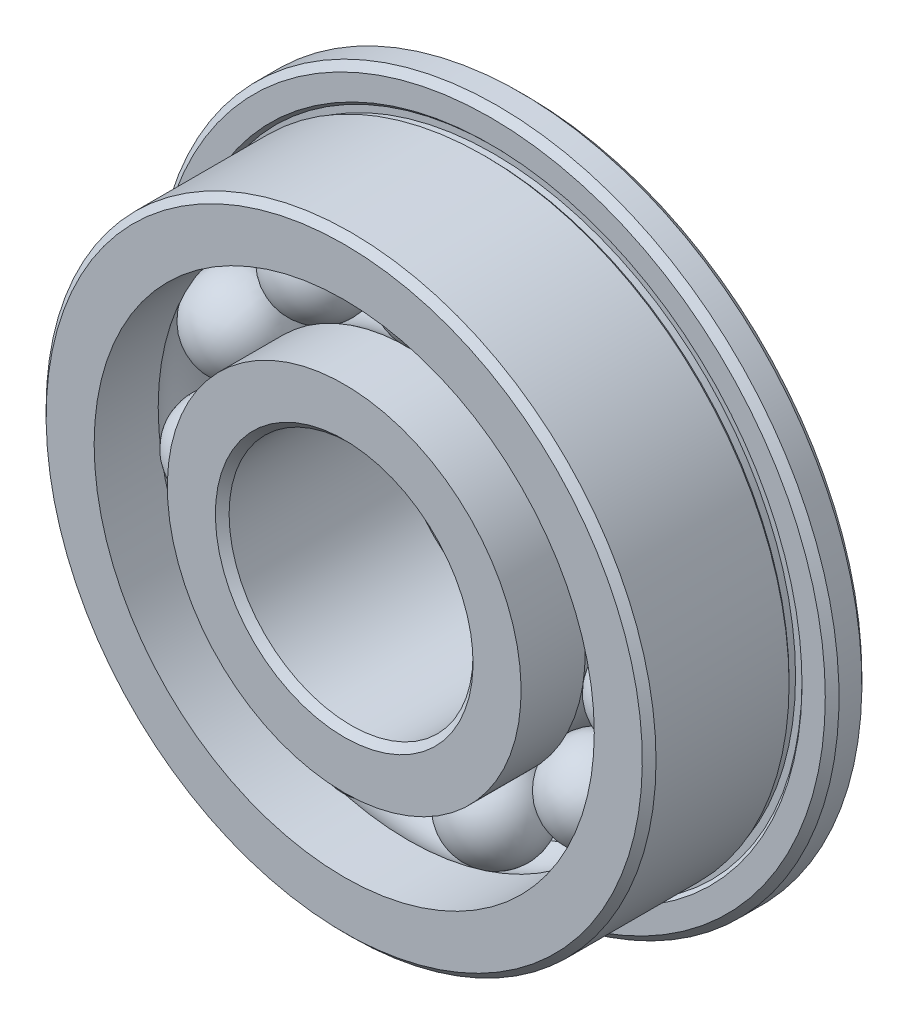
ISO-10303-21;
HEADER;
FILE_DESCRIPTION(('STEP AP214'),'2;1');
FILE_NAME('part.step','',(''),(''),'','','');
FILE_SCHEMA(('AUTOMOTIVE_DESIGN { 1 0 10303 214 1 1 1 1 }'));
ENDSEC;
DATA;
#1=APPLICATION_CONTEXT('core data for automotive mechanical design processes');
#2=APPLICATION_PROTOCOL_DEFINITION('international standard','automotive_design',2000,#1);
#3=PRODUCT_CONTEXT('',#1,'mechanical');
#4=PRODUCT('Part','Part','',(#3));
#5=PRODUCT_RELATED_PRODUCT_CATEGORY('part','',(#4));
#6=PRODUCT_DEFINITION_FORMATION('','',#4);
#7=PRODUCT_DEFINITION_CONTEXT('part definition',#1,'design');
#8=PRODUCT_DEFINITION('design','',#6,#7);
#9=PRODUCT_DEFINITION_SHAPE('','',#8);
#10=(LENGTH_UNIT() NAMED_UNIT(*) SI_UNIT(.MILLI.,.METRE.));
#11=(NAMED_UNIT(*) PLANE_ANGLE_UNIT() SI_UNIT($,.RADIAN.));
#12=(NAMED_UNIT(*) SI_UNIT($,.STERADIAN.) SOLID_ANGLE_UNIT());
#13=UNCERTAINTY_MEASURE_WITH_UNIT(LENGTH_MEASURE(1.E-05),#10,'distance_accuracy_value','');
#14=(GEOMETRIC_REPRESENTATION_CONTEXT(3) GLOBAL_UNCERTAINTY_ASSIGNED_CONTEXT((#13)) GLOBAL_UNIT_ASSIGNED_CONTEXT((#10,
#11,#12)) REPRESENTATION_CONTEXT('',''));
#15=CARTESIAN_POINT('',(0.,0.,0.));
#16=DIRECTION('',(0.,0.,1.));
#17=DIRECTION('',(1.,0.,0.));
#18=AXIS2_PLACEMENT_3D('',#15,#16,#17);
#19=CARTESIAN_POINT('',(-1.89224286109455,2.94438736490916,0.));
#20=DIRECTION('',(-0.540640817455586,0.841253532831188,0.));
#21=DIRECTION('',(0.841253532831188,0.540640817455586,0.));
#22=AXIS2_PLACEMENT_3D('',#19,#20,#21);
#23=SPHERICAL_SURFACE('',#22,0.75);
#24=CARTESIAN_POINT('',(-2.29772347418624,3.57532751453255,0.));
#25=VERTEX_POINT('',#24);
#26=VERTEX_LOOP('',#25);
#27=FACE_BOUND('',#26,.T.);
#28=ADVANCED_FACE('F43',(#27),#23,.T.);
#29=CLOSED_SHELL('',(#28));
#30=MANIFOLD_SOLID_BREP('B2',#29);
#31=CARTESIAN_POINT('',(-3.1837119837408,1.45395254550664,0.));
#32=DIRECTION('',(-0.909631995354514,0.415415013001897,0.));
#33=DIRECTION('',(0.415415013001897,0.909631995354514,0.));
#34=AXIS2_PLACEMENT_3D('',#31,#32,#33);
#35=SPHERICAL_SURFACE('',#34,0.75);
#36=CARTESIAN_POINT('',(-3.86593598025668,1.76551380525806,0.));
#37=VERTEX_POINT('',#36);
#38=VERTEX_LOOP('',#37);
#39=FACE_BOUND('',#38,.T.);
#40=ADVANCED_FACE('F63',(#39),#35,.T.);
#41=CLOSED_SHELL('',(#40));
#42=MANIFOLD_SOLID_BREP('B7',#41);
#43=CARTESIAN_POINT('',(-3.46437504658327,-0.498101933956461,0.));
#44=DIRECTION('',(-0.989821441880934,-0.142314838273275,0.));
#45=DIRECTION('',(-0.142314838273275,0.989821441880934,0.));
#46=AXIS2_PLACEMENT_3D('',#43,#44,#45);
#47=SPHERICAL_SURFACE('',#46,0.75);
#48=CARTESIAN_POINT('',(-4.20674112799397,-0.604838062661418,0.));
#49=VERTEX_POINT('',#48);
#50=VERTEX_LOOP('',#49);
#51=FACE_BOUND('',#50,.T.);
#52=ADVANCED_FACE('F83',(#51),#47,.T.);
#53=CLOSED_SHELL('',(#52));
#54=MANIFOLD_SOLID_BREP('B39',#53);
#55=CARTESIAN_POINT('',(-2.64512351023993,-2.29201256880847,0.));
#56=DIRECTION('',(-0.755749574354264,-0.654860733945278,0.));
#57=DIRECTION('',(-0.654860733945278,0.755749574354264,0.));
#58=AXIS2_PLACEMENT_3D('',#55,#56,#57);
#59=SPHERICAL_SURFACE('',#58,0.75);
#60=CARTESIAN_POINT('',(-3.21193569100562,-2.78315811926743,0.));
#61=VERTEX_POINT('',#60);
#62=VERTEX_LOOP('',#61);
#63=FACE_BOUND('',#62,.T.);
#64=ADVANCED_FACE('F103',(#63),#59,.T.);
#65=CLOSED_SHELL('',(#64));
#66=MANIFOLD_SOLID_BREP('B59',#65);
#67=CARTESIAN_POINT('',(-0.98606394894503,-3.35822540765073,0.));
#68=DIRECTION('',(-0.281732556841437,-0.959492973614495,0.));
#69=DIRECTION('',(-0.959492973614495,0.281732556841437,0.));
#70=AXIS2_PLACEMENT_3D('',#67,#68,#69);
#71=SPHERICAL_SURFACE('',#70,0.75);
#72=CARTESIAN_POINT('',(-1.19736336657611,-4.0778451378616,0.));
#73=VERTEX_POINT('',#72);
#74=VERTEX_LOOP('',#73);
#75=FACE_BOUND('',#74,.T.);
#76=ADVANCED_FACE('F123',(#75),#71,.T.);
#77=CLOSED_SHELL('',(#76));
#78=MANIFOLD_SOLID_BREP('B79',#77);
#79=CARTESIAN_POINT('',(0.986063948944982,-3.35822540765075,0.));
#80=DIRECTION('',(0.281732556841423,-0.959492973614499,0.));
#81=DIRECTION('',(-0.959492973614499,-0.281732556841423,0.));
#82=AXIS2_PLACEMENT_3D('',#79,#80,#81);
#83=SPHERICAL_SURFACE('',#82,0.75);
#84=CARTESIAN_POINT('',(1.19736336657605,-4.07784513786162,0.));
#85=VERTEX_POINT('',#84);
#86=VERTEX_LOOP('',#85);
#87=FACE_BOUND('',#86,.T.);
#88=ADVANCED_FACE('F143',(#87),#83,.T.);
#89=CLOSED_SHELL('',(#88));
#90=MANIFOLD_SOLID_BREP('B99',#89);
#91=CARTESIAN_POINT('',(2.64512351023989,-2.29201256880851,0.));
#92=DIRECTION('',(0.755749574354255,-0.654860733945289,0.));
#93=DIRECTION('',(-0.654860733945289,-0.755749574354255,0.));
#94=AXIS2_PLACEMENT_3D('',#91,#92,#93);
#95=SPHERICAL_SURFACE('',#94,0.75);
#96=CARTESIAN_POINT('',(3.21193569100558,-2.78315811926748,0.));
#97=VERTEX_POINT('',#96);
#98=VERTEX_LOOP('',#97);
#99=FACE_BOUND('',#98,.T.);
#100=ADVANCED_FACE('F163',(#99),#95,.T.);
#101=CLOSED_SHELL('',(#100));
#102=MANIFOLD_SOLID_BREP('B119',#101);
#103=CARTESIAN_POINT('',(3.46437504658326,-0.498101933956511,0.));
#104=DIRECTION('',(0.989821441880932,-0.142314838273289,0.));
#105=DIRECTION('',(-0.142314838273289,-0.989821441880932,0.));
#106=AXIS2_PLACEMENT_3D('',#103,#104,#105);
#107=SPHERICAL_SURFACE('',#106,0.75);
#108=CARTESIAN_POINT('',(4.20674112799396,-0.604838062661478,0.));
#109=VERTEX_POINT('',#108);
#110=VERTEX_LOOP('',#109);
#111=FACE_BOUND('',#110,.T.);
#112=ADVANCED_FACE('F183',(#111),#107,.T.);
#113=CLOSED_SHELL('',(#112));
#114=MANIFOLD_SOLID_BREP('B139',#113);
#115=CARTESIAN_POINT('',(3.18371198374082,1.45395254550659,0.));
#116=DIRECTION('',(0.909631995354519,0.415415013001884,0.));
#117=DIRECTION('',(0.415415013001884,-0.909631995354519,0.));
#118=AXIS2_PLACEMENT_3D('',#115,#116,#117);
#119=SPHERICAL_SURFACE('',#118,0.75);
#120=CARTESIAN_POINT('',(3.86593598025671,1.76551380525801,0.));
#121=VERTEX_POINT('',#120);
#122=VERTEX_LOOP('',#121);
#123=FACE_BOUND('',#122,.T.);
#124=ADVANCED_FACE('F203',(#123),#119,.T.);
#125=CLOSED_SHELL('',(#124));
#126=MANIFOLD_SOLID_BREP('B159',#125);
#127=CARTESIAN_POINT('',(1.8922428610946,2.94438736490913,0.));
#128=DIRECTION('',(0.540640817455599,0.841253532831181,0.));
#129=DIRECTION('',(0.841253532831181,-0.540640817455599,0.));
#130=AXIS2_PLACEMENT_3D('',#127,#128,#129);
#131=SPHERICAL_SURFACE('',#130,0.75);
#132=CARTESIAN_POINT('',(2.2977234741863,3.57532751453252,0.));
#133=VERTEX_POINT('',#132);
#134=VERTEX_LOOP('',#133);
#135=FACE_BOUND('',#134,.T.);
#136=ADVANCED_FACE('F223',(#135),#131,.T.);
#137=CLOSED_SHELL('',(#136));
#138=MANIFOLD_SOLID_BREP('B179',#137);
#139=CARTESIAN_POINT('',(0.,3.5,0.));
#140=DIRECTION('',(0.,1.,0.));
#141=DIRECTION('',(1.,0.,0.));
#142=AXIS2_PLACEMENT_3D('',#139,#140,#141);
#143=SPHERICAL_SURFACE('',#142,0.75);
#144=CARTESIAN_POINT('',(0.,4.25,0.));
#145=VERTEX_POINT('',#144);
#146=VERTEX_LOOP('',#145);
#147=FACE_BOUND('',#146,.T.);
#148=ADVANCED_FACE('F246',(#147),#143,.T.);
#149=CLOSED_SHELL('',(#148));
#150=MANIFOLD_SOLID_BREP('B199',#149);
#151=CARTESIAN_POINT('',(0.,0.,0.));
#152=DIRECTION('',(0.,0.,1.));
#153=DIRECTION('',(0.,-1.,0.));
#154=AXIS2_PLACEMENT_3D('',#151,#152,#153);
#155=CYLINDRICAL_SURFACE('',#154,2.9);
#156=CARTESIAN_POINT('',(0.,0.,-0.449999999999999));
#157=DIRECTION('',(0.,0.,1.));
#158=DIRECTION('',(0.,-1.,0.));
#159=AXIS2_PLACEMENT_3D('',#156,#157,#158);
#160=CIRCLE('',#159,2.9);
#161=CARTESIAN_POINT('',(0.,-2.9,-0.449999999999999));
#162=VERTEX_POINT('',#161);
#163=EDGE_CURVE('E287',#162,#162,#160,.T.);
#164=ORIENTED_EDGE('',*,*,#163,.F.);
#165=EDGE_LOOP('',(#164));
#166=FACE_BOUND('',#165,.T.);
#167=CARTESIAN_POINT('',(0.,0.,-1.5));
#168=DIRECTION('',(0.,0.,1.));
#169=DIRECTION('',(0.,-1.,0.));
#170=AXIS2_PLACEMENT_3D('',#167,#168,#169);
#171=CIRCLE('',#170,2.9);
#172=CARTESIAN_POINT('',(0.,-2.9,-1.5));
#173=VERTEX_POINT('',#172);
#174=EDGE_CURVE('E296',#173,#173,#171,.T.);
#175=ORIENTED_EDGE('',*,*,#174,.T.);
#176=EDGE_LOOP('',(#175));
#177=FACE_BOUND('',#176,.T.);
#178=ADVANCED_FACE('F267',(#166,#177),#155,.T.);
#179=CARTESIAN_POINT('',(0.,0.,0.));
#180=DIRECTION('',(0.,0.,1.));
#181=DIRECTION('',(0.,-1.,0.));
#182=AXIS2_PLACEMENT_3D('',#179,#180,#181);
#183=TOROIDAL_SURFACE('',#182,3.5,0.75);
#184=CARTESIAN_POINT('',(0.,0.,0.449999999999999));
#185=DIRECTION('',(0.,0.,1.));
#186=DIRECTION('',(0.,-1.,0.));
#187=AXIS2_PLACEMENT_3D('',#184,#185,#186);
#188=CIRCLE('',#187,2.9);
#189=CARTESIAN_POINT('',(0.,-2.9,0.449999999999999));
#190=VERTEX_POINT('',#189);
#191=EDGE_CURVE('E290',#190,#190,#188,.T.);
#192=ORIENTED_EDGE('',*,*,#191,.F.);
#193=EDGE_LOOP('',(#192));
#194=FACE_BOUND('',#193,.T.);
#195=ORIENTED_EDGE('',*,*,#163,.T.);
#196=EDGE_LOOP('',(#195));
#197=FACE_BOUND('',#196,.T.);
#198=ADVANCED_FACE('F315',(#194,#197),#183,.F.);
#199=CARTESIAN_POINT('',(0.,0.,0.));
#200=DIRECTION('',(0.,0.,1.));
#201=DIRECTION('',(0.,-1.,0.));
#202=AXIS2_PLACEMENT_3D('',#199,#200,#201);
#203=CYLINDRICAL_SURFACE('',#202,2.9);
#204=CARTESIAN_POINT('',(0.,0.,1.5));
#205=DIRECTION('',(0.,0.,1.));
#206=DIRECTION('',(0.,-1.,0.));
#207=AXIS2_PLACEMENT_3D('',#204,#205,#206);
#208=CIRCLE('',#207,2.9);
#209=CARTESIAN_POINT('',(0.,-2.9,1.5));
#210=VERTEX_POINT('',#209);
#211=EDGE_CURVE('E293',#210,#210,#208,.T.);
#212=ORIENTED_EDGE('',*,*,#211,.F.);
#213=EDGE_LOOP('',(#212));
#214=FACE_BOUND('',#213,.T.);
#215=ORIENTED_EDGE('',*,*,#191,.T.);
#216=EDGE_LOOP('',(#215));
#217=FACE_BOUND('',#216,.T.);
#218=ADVANCED_FACE('F321',(#214,#217),#203,.T.);
#219=CARTESIAN_POINT('',(0.,2.,1.5));
#220=DIRECTION('',(0.,0.,-1.));
#221=DIRECTION('',(0.,1.,0.));
#222=AXIS2_PLACEMENT_3D('',#219,#220,#221);
#223=PLANE('',#222);
#224=CARTESIAN_POINT('',(0.,0.,1.5));
#225=DIRECTION('',(0.,0.,-1.));
#226=DIRECTION('',(0.,1.,0.));
#227=AXIS2_PLACEMENT_3D('',#224,#225,#226);
#228=CIRCLE('',#227,2.1125);
#229=CARTESIAN_POINT('',(0.,-2.1125,1.5));
#230=VERTEX_POINT('',#229);
#231=EDGE_CURVE('E245',#230,#230,#228,.T.);
#232=ORIENTED_EDGE('',*,*,#231,.T.);
#233=EDGE_LOOP('',(#232));
#234=FACE_BOUND('',#233,.T.);
#235=ORIENTED_EDGE('',*,*,#211,.T.);
#236=EDGE_LOOP('',(#235));
#237=FACE_BOUND('',#236,.T.);
#238=ADVANCED_FACE('F312',(#234,#237),#223,.F.);
#239=CARTESIAN_POINT('',(0.,0.,0.));
#240=DIRECTION('',(0.,0.,1.));
#241=DIRECTION('',(0.,-1.,0.));
#242=AXIS2_PLACEMENT_3D('',#239,#240,#241);
#243=CYLINDRICAL_SURFACE('',#242,2.);
#244=CARTESIAN_POINT('',(0.,0.,-1.3875));
#245=DIRECTION('',(0.,0.,1.));
#246=DIRECTION('',(0.,-1.,0.));
#247=AXIS2_PLACEMENT_3D('',#244,#245,#246);
#248=CIRCLE('',#247,2.);
#249=CARTESIAN_POINT('',(0.,-2.,-1.3875));
#250=VERTEX_POINT('',#249);
#251=EDGE_CURVE('E274',#250,#250,#248,.F.);
#252=CARTESIAN_POINT('',(0.,0.,1.3875));
#253=DIRECTION('',(0.,0.,-1.));
#254=DIRECTION('',(0.,1.,0.));
#255=AXIS2_PLACEMENT_3D('',#252,#253,#254);
#256=CIRCLE('',#255,2.);
#257=CARTESIAN_POINT('',(0.,-2.,1.3875));
#258=VERTEX_POINT('',#257);
#259=EDGE_CURVE('E278',#258,#258,#256,.F.);
#260=CARTESIAN_POINT('',(0.,-2.,-1.3875));
#261=CARTESIAN_POINT('',(0.,-2.,-1.35859375));
#262=CARTESIAN_POINT('',(0.,-2.,-1.3296875));
#263=CARTESIAN_POINT('',(0.,-2.,-1.271875));
#264=CARTESIAN_POINT('',(0.,-2.,-1.24296875));
#265=CARTESIAN_POINT('',(0.,-2.,-1.18515625));
#266=CARTESIAN_POINT('',(0.,-2.,-1.15625));
#267=CARTESIAN_POINT('',(0.,-2.,-1.0984375));
#268=CARTESIAN_POINT('',(0.,-2.,-1.06953125));
#269=CARTESIAN_POINT('',(0.,-2.,-1.01171875));
#270=CARTESIAN_POINT('',(0.,-2.,-0.982812500000001));
#271=CARTESIAN_POINT('',(0.,-2.,-0.925000000000001));
#272=CARTESIAN_POINT('',(0.,-2.,-0.89609375));
#273=CARTESIAN_POINT('',(0.,-2.,-0.838281250000001));
#274=CARTESIAN_POINT('',(0.,-2.,-0.809375000000001));
#275=CARTESIAN_POINT('',(0.,-2.,-0.7515625));
#276=CARTESIAN_POINT('',(0.,-2.,-0.72265625));
#277=CARTESIAN_POINT('',(0.,-2.,-0.664843750000001));
#278=CARTESIAN_POINT('',(0.,-2.,-0.6359375));
#279=CARTESIAN_POINT('',(0.,-2.,-0.578125));
#280=CARTESIAN_POINT('',(0.,-2.,-0.54921875));
#281=CARTESIAN_POINT('',(0.,-2.,-0.49140625));
#282=CARTESIAN_POINT('',(0.,-2.,-0.4625));
#283=CARTESIAN_POINT('',(0.,-2.,-0.4046875));
#284=CARTESIAN_POINT('',(0.,-2.,-0.37578125));
#285=CARTESIAN_POINT('',(0.,-2.,-0.31796875));
#286=CARTESIAN_POINT('',(0.,-2.,-0.2890625));
#287=CARTESIAN_POINT('',(0.,-2.,-0.23125));
#288=CARTESIAN_POINT('',(0.,-2.,-0.20234375));
#289=CARTESIAN_POINT('',(0.,-2.,-0.14453125));
#290=CARTESIAN_POINT('',(0.,-2.,-0.115625));
#291=CARTESIAN_POINT('',(0.,-2.,-0.0578125000000002));
#292=CARTESIAN_POINT('',(0.,-2.,-0.0289062500000002));
#293=CARTESIAN_POINT('',(0.,-2.,0.0289062499999998));
#294=CARTESIAN_POINT('',(0.,-2.,0.0578124999999998));
#295=CARTESIAN_POINT('',(0.,-2.,0.115625));
#296=CARTESIAN_POINT('',(0.,-2.,0.14453125));
#297=CARTESIAN_POINT('',(0.,-2.,0.20234375));
#298=CARTESIAN_POINT('',(0.,-2.,0.23125));
#299=CARTESIAN_POINT('',(0.,-2.,0.2890625));
#300=CARTESIAN_POINT('',(0.,-2.,0.31796875));
#301=CARTESIAN_POINT('',(0.,-2.,0.37578125));
#302=CARTESIAN_POINT('',(0.,-2.,0.4046875));
#303=CARTESIAN_POINT('',(0.,-2.,0.4625));
#304=CARTESIAN_POINT('',(0.,-2.,0.49140625));
#305=CARTESIAN_POINT('',(0.,-2.,0.54921875));
#306=CARTESIAN_POINT('',(0.,-2.,0.578125));
#307=CARTESIAN_POINT('',(0.,-2.,0.6359375));
#308=CARTESIAN_POINT('',(0.,-2.,0.66484375));
#309=CARTESIAN_POINT('',(0.,-2.,0.72265625));
#310=CARTESIAN_POINT('',(0.,-2.,0.7515625));
#311=CARTESIAN_POINT('',(0.,-2.,0.809375));
#312=CARTESIAN_POINT('',(0.,-2.,0.83828125));
#313=CARTESIAN_POINT('',(0.,-2.,0.89609375));
#314=CARTESIAN_POINT('',(0.,-2.,0.925));
#315=CARTESIAN_POINT('',(0.,-2.,0.9828125));
#316=CARTESIAN_POINT('',(0.,-2.,1.01171875));
#317=CARTESIAN_POINT('',(0.,-2.,1.06953125));
#318=CARTESIAN_POINT('',(0.,-2.,1.0984375));
#319=CARTESIAN_POINT('',(0.,-2.,1.15625));
#320=CARTESIAN_POINT('',(0.,-2.,1.18515625));
#321=CARTESIAN_POINT('',(0.,-2.,1.24296875));
#322=CARTESIAN_POINT('',(0.,-2.,1.271875));
#323=CARTESIAN_POINT('',(0.,-2.,1.3296875));
#324=CARTESIAN_POINT('',(0.,-2.,1.35859375));
#325=CARTESIAN_POINT('',(0.,-2.,1.3875));
#326=B_SPLINE_CURVE_WITH_KNOTS('',3,(#260,#261,#262,#263,#264,#265,#266,#267,#268,#269,#270,
#271,#272,#273,#274,#275,#276,#277,#278,#279,#280,#281,#282,#283,#284,#285,#286,#287,#288,#289,
#290,#291,#292,#293,#294,#295,#296,#297,#298,#299,#300,#301,#302,#303,#304,#305,#306,#307,#308,
#309,#310,#311,#312,#313,#314,#315,#316,#317,#318,#319,#320,#321,#322,#323,#324,#325),
.UNSPECIFIED.,.F.,.F.,(4,2,2,2,2,2,2,2,2,2,2,2,2,2,2,2,2,2,2,2,2,2,2,2,2,2,2,2,2,2,2,2,4),(0.,
0.08671875,0.1734375,0.26015625,0.346875,0.43359375,0.5203125,0.60703125,0.69375,0.78046875,
0.8671875,0.95390625,1.040625,1.12734375,1.2140625,1.30078125,1.3875,1.47421875,1.5609375,
1.64765625,1.734375,1.82109375,1.9078125,1.99453125,2.08125,2.16796875,2.2546875,2.34140625,
2.428125,2.51484375,2.6015625,2.68828125,2.775),.UNSPECIFIED.);
#327=EDGE_CURVE('BSEAM304',#250,#258,#326,.T.);
#328=ORIENTED_EDGE('',*,*,#251,.T.);
#329=ORIENTED_EDGE('',*,*,#259,.T.);
#330=ORIENTED_EDGE('',*,*,#327,.T.);
#331=ORIENTED_EDGE('',*,*,#327,.F.);
#332=EDGE_LOOP('',(#328,#330,#329,#331));
#333=FACE_BOUND('',#332,.T.);
#334=ADVANCED_FACE('F304',(#333),#243,.F.);
#335=CARTESIAN_POINT('',(0.,2.9,-1.5));
#336=DIRECTION('',(0.,0.,1.));
#337=DIRECTION('',(0.,-1.,0.));
#338=AXIS2_PLACEMENT_3D('',#335,#336,#337);
#339=PLANE('',#338);
#340=CARTESIAN_POINT('',(0.,0.,-1.5));
#341=DIRECTION('',(0.,0.,1.));
#342=DIRECTION('',(0.,-1.,0.));
#343=AXIS2_PLACEMENT_3D('',#340,#341,#342);
#344=CIRCLE('',#343,2.1125);
#345=CARTESIAN_POINT('',(0.,-2.1125,-1.5));
#346=VERTEX_POINT('',#345);
#347=EDGE_CURVE('E282',#346,#346,#344,.T.);
#348=ORIENTED_EDGE('',*,*,#347,.T.);
#349=EDGE_LOOP('',(#348));
#350=FACE_BOUND('',#349,.T.);
#351=ORIENTED_EDGE('',*,*,#174,.F.);
#352=EDGE_LOOP('',(#351));
#353=FACE_BOUND('',#352,.T.);
#354=ADVANCED_FACE('F301',(#350,#353),#339,.F.);
#355=CARTESIAN_POINT('',(0.,0.,-1.5));
#356=DIRECTION('',(0.,0.,-1.));
#357=DIRECTION('',(0.,1.,0.));
#358=AXIS2_PLACEMENT_3D('',#355,#356,#357);
#359=CONICAL_SURFACE('',#358,2.1125,0.785398163397449);
#360=ORIENTED_EDGE('',*,*,#251,.F.);
#361=EDGE_LOOP('',(#360));
#362=FACE_BOUND('',#361,.T.);
#363=ORIENTED_EDGE('',*,*,#347,.F.);
#364=EDGE_LOOP('',(#363));
#365=FACE_BOUND('',#364,.T.);
#366=ADVANCED_FACE('F303',(#362,#365),#359,.F.);
#367=CARTESIAN_POINT('',(0.,0.,1.3875));
#368=DIRECTION('',(0.,0.,1.));
#369=DIRECTION('',(0.,-1.,0.));
#370=AXIS2_PLACEMENT_3D('',#367,#368,#369);
#371=CONICAL_SURFACE('',#370,2.,0.785398163397449);
#372=CARTESIAN_POINT('',(0.,-2.1125,1.5));
#373=CARTESIAN_POINT('',(0.,-2.111328125,1.498828125));
#374=CARTESIAN_POINT('',(0.,-2.11015625,1.49765625));
#375=CARTESIAN_POINT('',(0.,-2.1078125,1.4953125));
#376=CARTESIAN_POINT('',(0.,-2.106640625,1.494140625));
#377=CARTESIAN_POINT('',(0.,-2.104296875,1.491796875));
#378=CARTESIAN_POINT('',(0.,-2.103125,1.490625));
#379=CARTESIAN_POINT('',(0.,-2.10078125,1.48828125));
#380=CARTESIAN_POINT('',(0.,-2.099609375,1.487109375));
#381=CARTESIAN_POINT('',(0.,-2.097265625,1.484765625));
#382=CARTESIAN_POINT('',(0.,-2.09609375,1.48359375));
#383=CARTESIAN_POINT('',(0.,-2.09375,1.48125));
#384=CARTESIAN_POINT('',(0.,-2.092578125,1.480078125));
#385=CARTESIAN_POINT('',(0.,-2.090234375,1.477734375));
#386=CARTESIAN_POINT('',(0.,-2.0890625,1.4765625));
#387=CARTESIAN_POINT('',(0.,-2.08671875,1.47421875));
#388=CARTESIAN_POINT('',(0.,-2.085546875,1.473046875));
#389=CARTESIAN_POINT('',(0.,-2.083203125,1.470703125));
#390=CARTESIAN_POINT('',(0.,-2.08203125,1.46953125));
#391=CARTESIAN_POINT('',(0.,-2.0796875,1.4671875));
#392=CARTESIAN_POINT('',(0.,-2.078515625,1.466015625));
#393=CARTESIAN_POINT('',(0.,-2.076171875,1.463671875));
#394=CARTESIAN_POINT('',(0.,-2.075,1.4625));
#395=CARTESIAN_POINT('',(0.,-2.07265625,1.46015625));
#396=CARTESIAN_POINT('',(0.,-2.071484375,1.458984375));
#397=CARTESIAN_POINT('',(0.,-2.069140625,1.456640625));
#398=CARTESIAN_POINT('',(0.,-2.06796875,1.45546875));
#399=CARTESIAN_POINT('',(0.,-2.065625,1.453125));
#400=CARTESIAN_POINT('',(0.,-2.064453125,1.451953125));
#401=CARTESIAN_POINT('',(0.,-2.062109375,1.449609375));
#402=CARTESIAN_POINT('',(0.,-2.0609375,1.4484375));
#403=CARTESIAN_POINT('',(0.,-2.05859375,1.44609375));
#404=CARTESIAN_POINT('',(0.,-2.057421875,1.444921875));
#405=CARTESIAN_POINT('',(0.,-2.055078125,1.442578125));
#406=CARTESIAN_POINT('',(0.,-2.05390625,1.44140625));
#407=CARTESIAN_POINT('',(0.,-2.0515625,1.4390625));
#408=CARTESIAN_POINT('',(0.,-2.050390625,1.437890625));
#409=CARTESIAN_POINT('',(0.,-2.048046875,1.435546875));
#410=CARTESIAN_POINT('',(0.,-2.046875,1.434375));
#411=CARTESIAN_POINT('',(0.,-2.04453125,1.43203125));
#412=CARTESIAN_POINT('',(0.,-2.043359375,1.430859375));
#413=CARTESIAN_POINT('',(0.,-2.041015625,1.428515625));
#414=CARTESIAN_POINT('',(0.,-2.03984375,1.42734375));
#415=CARTESIAN_POINT('',(0.,-2.0375,1.425));
#416=CARTESIAN_POINT('',(0.,-2.036328125,1.423828125));
#417=CARTESIAN_POINT('',(0.,-2.033984375,1.421484375));
#418=CARTESIAN_POINT('',(0.,-2.0328125,1.4203125));
#419=CARTESIAN_POINT('',(0.,-2.03046875,1.41796875));
#420=CARTESIAN_POINT('',(0.,-2.029296875,1.416796875));
#421=CARTESIAN_POINT('',(0.,-2.026953125,1.414453125));
#422=CARTESIAN_POINT('',(0.,-2.02578125,1.41328125));
#423=CARTESIAN_POINT('',(0.,-2.0234375,1.4109375));
#424=CARTESIAN_POINT('',(0.,-2.022265625,1.409765625));
#425=CARTESIAN_POINT('',(0.,-2.019921875,1.407421875));
#426=CARTESIAN_POINT('',(0.,-2.01875,1.40625));
#427=CARTESIAN_POINT('',(0.,-2.01640625,1.40390625));
#428=CARTESIAN_POINT('',(0.,-2.015234375,1.402734375));
#429=CARTESIAN_POINT('',(0.,-2.012890625,1.400390625));
#430=CARTESIAN_POINT('',(0.,-2.01171875,1.39921875));
#431=CARTESIAN_POINT('',(0.,-2.009375,1.396875));
#432=CARTESIAN_POINT('',(0.,-2.008203125,1.395703125));
#433=CARTESIAN_POINT('',(0.,-2.005859375,1.393359375));
#434=CARTESIAN_POINT('',(0.,-2.0046875,1.3921875));
#435=CARTESIAN_POINT('',(0.,-2.00234375,1.38984375));
#436=CARTESIAN_POINT('',(0.,-2.001171875,1.388671875));
#437=CARTESIAN_POINT('',(0.,-2.,1.3875));
#438=B_SPLINE_CURVE_WITH_KNOTS('',3,(#372,#373,#374,#375,#376,#377,#378,#379,#380,#381,#382,
#383,#384,#385,#386,#387,#388,#389,#390,#391,#392,#393,#394,#395,#396,#397,#398,#399,#400,#401,
#402,#403,#404,#405,#406,#407,#408,#409,#410,#411,#412,#413,#414,#415,#416,#417,#418,#419,#420,
#421,#422,#423,#424,#425,#426,#427,#428,#429,#430,#431,#432,#433,#434,#435,#436,#437),
.UNSPECIFIED.,.F.,.F.,(4,2,2,2,2,2,2,2,2,2,2,2,2,2,2,2,2,2,2,2,2,2,2,2,2,2,2,2,2,2,2,2,4),(0.,
0.00497184455521783,0.0099436891104358,0.0149155336656538,0.0198873782208718,0.0248592227760896,
0.0298310673313076,0.0348029118865255,0.0397747564417435,0.0447466009969612,0.049718445552179,
0.054690290107397,0.059662134662615,0.064633979217833,0.0696058237730509,0.0745776683282687,
0.0795495128834867,0.0845213574387047,0.0894932019939227,0.0944650465491402,0.0994368911043581,
0.104408735659576,0.109380580214794,0.114352424770012,0.11932426932523,0.124296113880448,
0.129267958435666,0.134239802990884,0.139211647546102,0.14418349210132,0.149155336656537,
0.154127181211755,0.159099025766973),.UNSPECIFIED.);
#439=EDGE_CURVE('BSEAM269',#230,#258,#438,.T.);
#440=ORIENTED_EDGE('',*,*,#231,.F.);
#441=ORIENTED_EDGE('',*,*,#259,.F.);
#442=ORIENTED_EDGE('',*,*,#439,.T.);
#443=ORIENTED_EDGE('',*,*,#439,.F.);
#444=EDGE_LOOP('',(#440,#442,#441,#443));
#445=FACE_BOUND('',#444,.T.);
#446=ADVANCED_FACE('F269',(#445),#371,.F.);
#447=CLOSED_SHELL('',(#178,#198,#218,#238,#334,#354,#366,#446));
#448=MANIFOLD_SOLID_BREP('B219',#447);
#449=CARTESIAN_POINT('',(0.,4.1,-1.5));
#450=DIRECTION('',(0.,0.,1.));
#451=DIRECTION('',(0.,-1.,0.));
#452=AXIS2_PLACEMENT_3D('',#449,#450,#451);
#453=PLANE('',#452);
#454=CARTESIAN_POINT('',(0.,0.,-1.5));
#455=DIRECTION('',(0.,0.,1.));
#456=DIRECTION('',(0.,-1.,0.));
#457=AXIS2_PLACEMENT_3D('',#454,#455,#456);
#458=CIRCLE('',#457,5.4875);
#459=CARTESIAN_POINT('',(0.,-5.4875,-1.5));
#460=VERTEX_POINT('',#459);
#461=EDGE_CURVE('E404',#460,#460,#458,.F.);
#462=ORIENTED_EDGE('',*,*,#461,.T.);
#463=EDGE_LOOP('',(#462));
#464=FACE_BOUND('',#463,.T.);
#465=CARTESIAN_POINT('',(0.,0.,-1.5));
#466=DIRECTION('',(0.,0.,1.));
#467=DIRECTION('',(0.,-1.,0.));
#468=AXIS2_PLACEMENT_3D('',#465,#466,#467);
#469=CIRCLE('',#468,4.1);
#470=CARTESIAN_POINT('',(0.,-4.1,-1.5));
#471=VERTEX_POINT('',#470);
#472=EDGE_CURVE('E415',#471,#471,#469,.T.);
#473=ORIENTED_EDGE('',*,*,#472,.T.);
#474=EDGE_LOOP('',(#473));
#475=FACE_BOUND('',#474,.T.);
#476=ADVANCED_FACE('F389',(#464,#475),#453,.F.);
#477=CARTESIAN_POINT('',(0.,0.,0.));
#478=DIRECTION('',(0.,0.,1.));
#479=DIRECTION('',(0.,-1.,0.));
#480=AXIS2_PLACEMENT_3D('',#477,#478,#479);
#481=CYLINDRICAL_SURFACE('',#480,4.1);
#482=ORIENTED_EDGE('',*,*,#472,.F.);
#483=EDGE_LOOP('',(#482));
#484=FACE_BOUND('',#483,.T.);
#485=CARTESIAN_POINT('',(0.,0.,-0.45));
#486=DIRECTION('',(0.,0.,1.));
#487=DIRECTION('',(0.,-1.,0.));
#488=AXIS2_PLACEMENT_3D('',#485,#486,#487);
#489=CIRCLE('',#488,4.1);
#490=CARTESIAN_POINT('',(0.,-4.1,-0.45));
#491=VERTEX_POINT('',#490);
#492=EDGE_CURVE('E418',#491,#491,#489,.T.);
#493=ORIENTED_EDGE('',*,*,#492,.T.);
#494=EDGE_LOOP('',(#493));
#495=FACE_BOUND('',#494,.T.);
#496=ADVANCED_FACE('F461',(#484,#495),#481,.F.);
#497=CARTESIAN_POINT('',(0.,0.,0.));
#498=DIRECTION('',(0.,0.,1.));
#499=DIRECTION('',(0.,-1.,0.));
#500=AXIS2_PLACEMENT_3D('',#497,#498,#499);
#501=TOROIDAL_SURFACE('',#500,3.5,0.75);
#502=ORIENTED_EDGE('',*,*,#492,.F.);
#503=EDGE_LOOP('',(#502));
#504=FACE_BOUND('',#503,.T.);
#505=CARTESIAN_POINT('',(0.,0.,0.449999999999999));
#506=DIRECTION('',(0.,0.,1.));
#507=DIRECTION('',(0.,-1.,0.));
#508=AXIS2_PLACEMENT_3D('',#505,#506,#507);
#509=CIRCLE('',#508,4.1);
#510=CARTESIAN_POINT('',(0.,-4.1,0.449999999999999));
#511=VERTEX_POINT('',#510);
#512=EDGE_CURVE('E421',#511,#511,#509,.T.);
#513=ORIENTED_EDGE('',*,*,#512,.T.);
#514=EDGE_LOOP('',(#513));
#515=FACE_BOUND('',#514,.T.);
#516=ADVANCED_FACE('F467',(#504,#515),#501,.F.);
#517=CARTESIAN_POINT('',(0.,0.,0.));
#518=DIRECTION('',(0.,0.,1.));
#519=DIRECTION('',(0.,-1.,0.));
#520=AXIS2_PLACEMENT_3D('',#517,#518,#519);
#521=CYLINDRICAL_SURFACE('',#520,4.1);
#522=ORIENTED_EDGE('',*,*,#512,.F.);
#523=EDGE_LOOP('',(#522));
#524=FACE_BOUND('',#523,.T.);
#525=CARTESIAN_POINT('',(0.,0.,1.5));
#526=DIRECTION('',(0.,0.,1.));
#527=DIRECTION('',(0.,-1.,0.));
#528=AXIS2_PLACEMENT_3D('',#525,#526,#527);
#529=CIRCLE('',#528,4.1);
#530=CARTESIAN_POINT('',(0.,-4.1,1.5));
#531=VERTEX_POINT('',#530);
#532=EDGE_CURVE('E424',#531,#531,#529,.T.);
#533=ORIENTED_EDGE('',*,*,#532,.T.);
#534=EDGE_LOOP('',(#533));
#535=FACE_BOUND('',#534,.T.);
#536=ADVANCED_FACE('F531',(#524,#535),#521,.F.);
#537=CARTESIAN_POINT('',(0.,5.,1.5));
#538=DIRECTION('',(0.,0.,-1.));
#539=DIRECTION('',(0.,1.,0.));
#540=AXIS2_PLACEMENT_3D('',#537,#538,#539);
#541=PLANE('',#540);
#542=CARTESIAN_POINT('',(0.,0.,1.5));
#543=DIRECTION('',(0.,0.,-1.));
#544=DIRECTION('',(0.,1.,0.));
#545=AXIS2_PLACEMENT_3D('',#542,#543,#544);
#546=CIRCLE('',#545,4.8875);
#547=CARTESIAN_POINT('',(0.,4.8875,1.5));
#548=VERTEX_POINT('',#547);
#549=EDGE_CURVE('E396',#548,#548,#546,.F.);
#550=ORIENTED_EDGE('',*,*,#549,.T.);
#551=EDGE_LOOP('',(#550));
#552=FACE_BOUND('',#551,.T.);
#553=ORIENTED_EDGE('',*,*,#532,.F.);
#554=EDGE_LOOP('',(#553));
#555=FACE_BOUND('',#554,.T.);
#556=ADVANCED_FACE('F521',(#552,#555),#541,.F.);
#557=CARTESIAN_POINT('',(0.,0.,0.));
#558=DIRECTION('',(0.,0.,1.));
#559=DIRECTION('',(0.,-1.,0.));
#560=AXIS2_PLACEMENT_3D('',#557,#558,#559);
#561=CYLINDRICAL_SURFACE('',#560,5.);
#562=CARTESIAN_POINT('',(0.,0.,1.3875));
#563=DIRECTION('',(0.,0.,-1.));
#564=DIRECTION('',(0.,1.,0.));
#565=AXIS2_PLACEMENT_3D('',#562,#563,#564);
#566=CIRCLE('',#565,5.);
#567=CARTESIAN_POINT('',(0.,5.,1.3875));
#568=VERTEX_POINT('',#567);
#569=EDGE_CURVE('E266',#568,#568,#566,.T.);
#570=ORIENTED_EDGE('',*,*,#569,.T.);
#571=EDGE_LOOP('',(#570));
#572=FACE_BOUND('',#571,.T.);
#573=CARTESIAN_POINT('',(0.,0.,-0.793933982822015));
#574=DIRECTION('',(0.,0.,1.));
#575=DIRECTION('',(0.,-1.,0.));
#576=AXIS2_PLACEMENT_3D('',#573,#574,#575);
#577=CIRCLE('',#576,5.);
#578=CARTESIAN_POINT('',(0.,-5.,-0.793933982822016));
#579=VERTEX_POINT('',#578);
#580=EDGE_CURVE('E427',#579,#579,#577,.T.);
#581=ORIENTED_EDGE('',*,*,#580,.T.);
#582=EDGE_LOOP('',(#581));
#583=FACE_BOUND('',#582,.T.);
#584=ADVANCED_FACE('F515',(#572,#583),#561,.T.);
#585=CARTESIAN_POINT('',(0.,0.,-0.84696699141101));
#586=DIRECTION('',(0.,0.,1.));
#587=DIRECTION('',(0.,-1.,0.));
#588=AXIS2_PLACEMENT_3D('',#585,#586,#587);
#589=CONICAL_SURFACE('',#588,4.94696699141101,0.785398163397436);
#590=ORIENTED_EDGE('',*,*,#580,.F.);
#591=EDGE_LOOP('',(#590));
#592=FACE_BOUND('',#591,.T.);
#593=CARTESIAN_POINT('',(0.,0.,-0.84696699141101));
#594=DIRECTION('',(0.,0.,1.));
#595=DIRECTION('',(0.,-1.,0.));
#596=AXIS2_PLACEMENT_3D('',#593,#594,#595);
#597=CIRCLE('',#596,4.94696699141101);
#598=CARTESIAN_POINT('',(0.,-4.94696699141101,-0.84696699141101));
#599=VERTEX_POINT('',#598);
#600=EDGE_CURVE('E430',#599,#599,#597,.T.);
#601=ORIENTED_EDGE('',*,*,#600,.T.);
#602=EDGE_LOOP('',(#601));
#603=FACE_BOUND('',#602,.T.);
#604=ADVANCED_FACE('F520',(#592,#603),#589,.T.);
#605=CARTESIAN_POINT('',(0.,0.,0.));
#606=DIRECTION('',(0.,0.,1.));
#607=DIRECTION('',(0.,-1.,0.));
#608=AXIS2_PLACEMENT_3D('',#605,#606,#607);
#609=CYLINDRICAL_SURFACE('',#608,4.94696699141101);
#610=ORIENTED_EDGE('',*,*,#600,.F.);
#611=EDGE_LOOP('',(#610));
#612=FACE_BOUND('',#611,.T.);
#613=CARTESIAN_POINT('',(0.,0.,-0.953033008588993));
#614=DIRECTION('',(0.,0.,1.));
#615=DIRECTION('',(0.,-1.,0.));
#616=AXIS2_PLACEMENT_3D('',#613,#614,#615);
#617=CIRCLE('',#616,4.94696699141101);
#618=CARTESIAN_POINT('',(0.,-4.94696699141101,-0.953033008588993));
#619=VERTEX_POINT('',#618);
#620=EDGE_CURVE('E433',#619,#619,#617,.T.);
#621=ORIENTED_EDGE('',*,*,#620,.T.);
#622=EDGE_LOOP('',(#621));
#623=FACE_BOUND('',#622,.T.);
#624=ADVANCED_FACE('F553',(#612,#623),#609,.T.);
#625=CARTESIAN_POINT('',(0.,5.05303300858899,-0.953033008588992));
#626=DIRECTION('',(0.,0.,-1.));
#627=DIRECTION('',(0.,1.,0.));
#628=AXIS2_PLACEMENT_3D('',#625,#626,#627);
#629=PLANE('',#628);
#630=ORIENTED_EDGE('',*,*,#620,.F.);
#631=EDGE_LOOP('',(#630));
#632=FACE_BOUND('',#631,.T.);
#633=CARTESIAN_POINT('',(0.,0.,-0.953033008588992));
#634=DIRECTION('',(0.,0.,1.));
#635=DIRECTION('',(0.,-1.,0.));
#636=AXIS2_PLACEMENT_3D('',#633,#634,#635);
#637=CIRCLE('',#636,5.05303300858899);
#638=CARTESIAN_POINT('',(0.,-5.05303300858899,-0.953033008588992));
#639=VERTEX_POINT('',#638);
#640=EDGE_CURVE('E436',#639,#639,#637,.T.);
#641=ORIENTED_EDGE('',*,*,#640,.T.);
#642=EDGE_LOOP('',(#641));
#643=FACE_BOUND('',#642,.T.);
#644=ADVANCED_FACE('F457',(#632,#643),#629,.F.);
#645=CARTESIAN_POINT('',(0.,0.,-0.900000000000001));
#646=DIRECTION('',(0.,0.,1.));
#647=DIRECTION('',(0.,-1.,0.));
#648=AXIS2_PLACEMENT_3D('',#645,#646,#647);
#649=CONICAL_SURFACE('',#648,5.10606601717798,0.785398163397436);
#650=ORIENTED_EDGE('',*,*,#640,.F.);
#651=EDGE_LOOP('',(#650));
#652=FACE_BOUND('',#651,.T.);
#653=CARTESIAN_POINT('',(0.,0.,-0.900000000000001));
#654=DIRECTION('',(0.,0.,1.));
#655=DIRECTION('',(0.,-1.,0.));
#656=AXIS2_PLACEMENT_3D('',#653,#654,#655);
#657=CIRCLE('',#656,5.10606601717798);
#658=CARTESIAN_POINT('',(0.,-5.10606601717798,-0.900000000000001));
#659=VERTEX_POINT('',#658);
#660=EDGE_CURVE('E439',#659,#659,#657,.T.);
#661=ORIENTED_EDGE('',*,*,#660,.T.);
#662=EDGE_LOOP('',(#661));
#663=FACE_BOUND('',#662,.T.);
#664=ADVANCED_FACE('F443',(#652,#663),#649,.F.);
#665=CARTESIAN_POINT('',(0.,5.6,-0.900000000000001));
#666=DIRECTION('',(0.,0.,-1.));
#667=DIRECTION('',(0.,1.,0.));
#668=AXIS2_PLACEMENT_3D('',#665,#666,#667);
#669=PLANE('',#668);
#670=CARTESIAN_POINT('',(0.,0.,-0.900000000000001));
#671=DIRECTION('',(0.,0.,-1.));
#672=DIRECTION('',(0.,1.,0.));
#673=AXIS2_PLACEMENT_3D('',#670,#671,#672);
#674=CIRCLE('',#673,5.4875);
#675=CARTESIAN_POINT('',(0.,5.4875,-0.900000000000001));
#676=VERTEX_POINT('',#675);
#677=EDGE_CURVE('E400',#676,#676,#674,.F.);
#678=ORIENTED_EDGE('',*,*,#677,.T.);
#679=EDGE_LOOP('',(#678));
#680=FACE_BOUND('',#679,.T.);
#681=ORIENTED_EDGE('',*,*,#660,.F.);
#682=EDGE_LOOP('',(#681));
#683=FACE_BOUND('',#682,.T.);
#684=ADVANCED_FACE('F445',(#680,#683),#669,.F.);
#685=CARTESIAN_POINT('',(0.,0.,0.));
#686=DIRECTION('',(0.,0.,1.));
#687=DIRECTION('',(0.,-1.,0.));
#688=AXIS2_PLACEMENT_3D('',#685,#686,#687);
#689=CYLINDRICAL_SURFACE('',#688,5.6);
#690=CARTESIAN_POINT('',(0.,0.,-1.3875));
#691=DIRECTION('',(0.,0.,1.));
#692=DIRECTION('',(0.,-1.,0.));
#693=AXIS2_PLACEMENT_3D('',#690,#691,#692);
#694=CIRCLE('',#693,5.6);
#695=CARTESIAN_POINT('',(0.,-5.6,-1.3875));
#696=VERTEX_POINT('',#695);
#697=EDGE_CURVE('E409',#696,#696,#694,.T.);
#698=ORIENTED_EDGE('',*,*,#697,.T.);
#699=EDGE_LOOP('',(#698));
#700=FACE_BOUND('',#699,.T.);
#701=CARTESIAN_POINT('',(0.,0.,-1.0125));
#702=DIRECTION('',(0.,0.,-1.));
#703=DIRECTION('',(0.,1.,0.));
#704=AXIS2_PLACEMENT_3D('',#701,#702,#703);
#705=CIRCLE('',#704,5.6);
#706=CARTESIAN_POINT('',(0.,5.6,-1.0125));
#707=VERTEX_POINT('',#706);
#708=EDGE_CURVE('E412',#707,#707,#705,.T.);
#709=ORIENTED_EDGE('',*,*,#708,.T.);
#710=EDGE_LOOP('',(#709));
#711=FACE_BOUND('',#710,.T.);
#712=ADVANCED_FACE('F447',(#700,#711),#689,.T.);
#713=CARTESIAN_POINT('',(0.,0.,-1.3875));
#714=DIRECTION('',(0.,0.,1.));
#715=DIRECTION('',(0.,-1.,0.));
#716=AXIS2_PLACEMENT_3D('',#713,#714,#715);
#717=CONICAL_SURFACE('',#716,5.6,0.785398163397447);
#718=CARTESIAN_POINT('',(0.,-5.4875,-1.5));
#719=CARTESIAN_POINT('',(0.,-5.488671875,-1.498828125));
#720=CARTESIAN_POINT('',(0.,-5.48984375,-1.49765625));
#721=CARTESIAN_POINT('',(0.,-5.4921875,-1.4953125));
#722=CARTESIAN_POINT('',(0.,-5.493359375,-1.494140625));
#723=CARTESIAN_POINT('',(0.,-5.495703125,-1.491796875));
#724=CARTESIAN_POINT('',(0.,-5.496875,-1.490625));
#725=CARTESIAN_POINT('',(0.,-5.49921875,-1.48828125));
#726=CARTESIAN_POINT('',(0.,-5.500390625,-1.487109375));
#727=CARTESIAN_POINT('',(0.,-5.502734375,-1.484765625));
#728=CARTESIAN_POINT('',(0.,-5.50390625,-1.48359375));
#729=CARTESIAN_POINT('',(0.,-5.50625,-1.48125));
#730=CARTESIAN_POINT('',(0.,-5.507421875,-1.480078125));
#731=CARTESIAN_POINT('',(0.,-5.509765625,-1.477734375));
#732=CARTESIAN_POINT('',(0.,-5.5109375,-1.4765625));
#733=CARTESIAN_POINT('',(0.,-5.51328125,-1.47421875));
#734=CARTESIAN_POINT('',(0.,-5.514453125,-1.473046875));
#735=CARTESIAN_POINT('',(0.,-5.516796875,-1.470703125));
#736=CARTESIAN_POINT('',(0.,-5.51796875,-1.46953125));
#737=CARTESIAN_POINT('',(0.,-5.5203125,-1.4671875));
#738=CARTESIAN_POINT('',(0.,-5.521484375,-1.466015625));
#739=CARTESIAN_POINT('',(0.,-5.523828125,-1.463671875));
#740=CARTESIAN_POINT('',(0.,-5.525,-1.4625));
#741=CARTESIAN_POINT('',(0.,-5.52734375,-1.46015625));
#742=CARTESIAN_POINT('',(0.,-5.528515625,-1.458984375));
#743=CARTESIAN_POINT('',(0.,-5.530859375,-1.456640625));
#744=CARTESIAN_POINT('',(0.,-5.53203125,-1.45546875));
#745=CARTESIAN_POINT('',(0.,-5.534375,-1.453125));
#746=CARTESIAN_POINT('',(0.,-5.535546875,-1.451953125));
#747=CARTESIAN_POINT('',(0.,-5.537890625,-1.449609375));
#748=CARTESIAN_POINT('',(0.,-5.5390625,-1.4484375));
#749=CARTESIAN_POINT('',(0.,-5.54140625,-1.44609375));
#750=CARTESIAN_POINT('',(0.,-5.542578125,-1.444921875));
#751=CARTESIAN_POINT('',(0.,-5.544921875,-1.442578125));
#752=CARTESIAN_POINT('',(0.,-5.54609375,-1.44140625));
#753=CARTESIAN_POINT('',(0.,-5.5484375,-1.4390625));
#754=CARTESIAN_POINT('',(0.,-5.549609375,-1.437890625));
#755=CARTESIAN_POINT('',(0.,-5.551953125,-1.435546875));
#756=CARTESIAN_POINT('',(0.,-5.553125,-1.434375));
#757=CARTESIAN_POINT('',(0.,-5.55546875,-1.43203125));
#758=CARTESIAN_POINT('',(0.,-5.556640625,-1.430859375));
#759=CARTESIAN_POINT('',(0.,-5.558984375,-1.428515625));
#760=CARTESIAN_POINT('',(0.,-5.56015625,-1.42734375));
#761=CARTESIAN_POINT('',(0.,-5.5625,-1.425));
#762=CARTESIAN_POINT('',(0.,-5.563671875,-1.423828125));
#763=CARTESIAN_POINT('',(0.,-5.566015625,-1.421484375));
#764=CARTESIAN_POINT('',(0.,-5.5671875,-1.4203125));
#765=CARTESIAN_POINT('',(0.,-5.56953125,-1.41796875));
#766=CARTESIAN_POINT('',(0.,-5.570703125,-1.416796875));
#767=CARTESIAN_POINT('',(0.,-5.573046875,-1.414453125));
#768=CARTESIAN_POINT('',(0.,-5.57421875,-1.41328125));
#769=CARTESIAN_POINT('',(0.,-5.5765625,-1.4109375));
#770=CARTESIAN_POINT('',(0.,-5.577734375,-1.409765625));
#771=CARTESIAN_POINT('',(0.,-5.580078125,-1.407421875));
#772=CARTESIAN_POINT('',(0.,-5.58125,-1.40625));
#773=CARTESIAN_POINT('',(0.,-5.58359375,-1.40390625));
#774=CARTESIAN_POINT('',(0.,-5.584765625,-1.402734375));
#775=CARTESIAN_POINT('',(0.,-5.587109375,-1.400390625));
#776=CARTESIAN_POINT('',(0.,-5.58828125,-1.39921875));
#777=CARTESIAN_POINT('',(0.,-5.590625,-1.396875));
#778=CARTESIAN_POINT('',(0.,-5.591796875,-1.395703125));
#779=CARTESIAN_POINT('',(0.,-5.594140625,-1.393359375));
#780=CARTESIAN_POINT('',(0.,-5.5953125,-1.3921875));
#781=CARTESIAN_POINT('',(0.,-5.59765625,-1.38984375));
#782=CARTESIAN_POINT('',(0.,-5.598828125,-1.388671875));
#783=CARTESIAN_POINT('',(0.,-5.6,-1.3875));
#784=B_SPLINE_CURVE_WITH_KNOTS('',3,(#718,#719,#720,#721,#722,#723,#724,#725,#726,#727,#728,
#729,#730,#731,#732,#733,#734,#735,#736,#737,#738,#739,#740,#741,#742,#743,#744,#745,#746,#747,
#748,#749,#750,#751,#752,#753,#754,#755,#756,#757,#758,#759,#760,#761,#762,#763,#764,#765,#766,
#767,#768,#769,#770,#771,#772,#773,#774,#775,#776,#777,#778,#779,#780,#781,#782,#783),
.UNSPECIFIED.,.F.,.F.,(4,2,2,2,2,2,2,2,2,2,2,2,2,2,2,2,2,2,2,2,2,2,2,2,2,2,2,2,2,2,2,2,4),(0.,
0.00497184455521767,0.00994368911043596,0.0149155336656536,0.0198873782208719,
0.0248592227760894,0.0298310673313071,0.0348029118865254,0.0397747564417431,0.0447466009969614,
0.0497184455521789,0.0546902901073972,0.0596621346626148,0.0646339792178331,0.0696058237730506,
0.0745776683282683,0.0795495128834866,0.0845213574387043,0.0894932019939225,0.09446504654914,
0.0994368911043583,0.104408735659576,0.109380580214794,0.114352424770012,0.11932426932523,
0.124296113880448,0.129267958435665,0.134239802990884,0.139211647546101,0.14418349210132,
0.149155336656537,0.154127181211755,0.159099025766973),.UNSPECIFIED.);
#785=EDGE_CURVE('BSEAM454',#460,#696,#784,.T.);
#786=ORIENTED_EDGE('',*,*,#461,.F.);
#787=ORIENTED_EDGE('',*,*,#697,.F.);
#788=ORIENTED_EDGE('',*,*,#785,.T.);
#789=ORIENTED_EDGE('',*,*,#785,.F.);
#790=EDGE_LOOP('',(#786,#788,#787,#789));
#791=FACE_BOUND('',#790,.T.);
#792=ADVANCED_FACE('F454',(#791),#717,.T.);
#793=CARTESIAN_POINT('',(0.,0.,-0.900000000000001));
#794=DIRECTION('',(0.,0.,-1.));
#795=DIRECTION('',(0.,1.,0.));
#796=AXIS2_PLACEMENT_3D('',#793,#794,#795);
#797=CONICAL_SURFACE('',#796,5.4875,0.785398163397448);
#798=ORIENTED_EDGE('',*,*,#708,.F.);
#799=EDGE_LOOP('',(#798));
#800=FACE_BOUND('',#799,.T.);
#801=ORIENTED_EDGE('',*,*,#677,.F.);
#802=EDGE_LOOP('',(#801));
#803=FACE_BOUND('',#802,.T.);
#804=ADVANCED_FACE('F474',(#800,#803),#797,.T.);
#805=CARTESIAN_POINT('',(0.,0.,1.5));
#806=DIRECTION('',(0.,0.,-1.));
#807=DIRECTION('',(0.,1.,0.));
#808=AXIS2_PLACEMENT_3D('',#805,#806,#807);
#809=CONICAL_SURFACE('',#808,4.8875,0.785398163397447);
#810=CARTESIAN_POINT('',(0.,5.,1.3875));
#811=CARTESIAN_POINT('',(0.,4.998828125,1.388671875));
#812=CARTESIAN_POINT('',(0.,4.99765625,1.38984375));
#813=CARTESIAN_POINT('',(0.,4.9953125,1.3921875));
#814=CARTESIAN_POINT('',(0.,4.994140625,1.393359375));
#815=CARTESIAN_POINT('',(0.,4.991796875,1.395703125));
#816=CARTESIAN_POINT('',(0.,4.990625,1.396875));
#817=CARTESIAN_POINT('',(0.,4.98828125,1.39921875));
#818=CARTESIAN_POINT('',(0.,4.987109375,1.400390625));
#819=CARTESIAN_POINT('',(0.,4.984765625,1.402734375));
#820=CARTESIAN_POINT('',(0.,4.98359375,1.40390625));
#821=CARTESIAN_POINT('',(0.,4.98125,1.40625));
#822=CARTESIAN_POINT('',(0.,4.980078125,1.407421875));
#823=CARTESIAN_POINT('',(0.,4.977734375,1.409765625));
#824=CARTESIAN_POINT('',(0.,4.9765625,1.4109375));
#825=CARTESIAN_POINT('',(0.,4.97421875,1.41328125));
#826=CARTESIAN_POINT('',(0.,4.973046875,1.414453125));
#827=CARTESIAN_POINT('',(0.,4.970703125,1.416796875));
#828=CARTESIAN_POINT('',(0.,4.96953125,1.41796875));
#829=CARTESIAN_POINT('',(0.,4.9671875,1.4203125));
#830=CARTESIAN_POINT('',(0.,4.966015625,1.421484375));
#831=CARTESIAN_POINT('',(0.,4.963671875,1.423828125));
#832=CARTESIAN_POINT('',(0.,4.9625,1.425));
#833=CARTESIAN_POINT('',(0.,4.96015625,1.42734375));
#834=CARTESIAN_POINT('',(0.,4.958984375,1.428515625));
#835=CARTESIAN_POINT('',(0.,4.956640625,1.430859375));
#836=CARTESIAN_POINT('',(0.,4.95546875,1.43203125));
#837=CARTESIAN_POINT('',(0.,4.953125,1.434375));
#838=CARTESIAN_POINT('',(0.,4.951953125,1.435546875));
#839=CARTESIAN_POINT('',(0.,4.949609375,1.437890625));
#840=CARTESIAN_POINT('',(0.,4.9484375,1.4390625));
#841=CARTESIAN_POINT('',(0.,4.94609375,1.44140625));
#842=CARTESIAN_POINT('',(0.,4.944921875,1.442578125));
#843=CARTESIAN_POINT('',(0.,4.942578125,1.444921875));
#844=CARTESIAN_POINT('',(0.,4.94140625,1.44609375));
#845=CARTESIAN_POINT('',(0.,4.9390625,1.4484375));
#846=CARTESIAN_POINT('',(0.,4.937890625,1.449609375));
#847=CARTESIAN_POINT('',(0.,4.935546875,1.451953125));
#848=CARTESIAN_POINT('',(0.,4.934375,1.453125));
#849=CARTESIAN_POINT('',(0.,4.93203125,1.45546875));
#850=CARTESIAN_POINT('',(0.,4.930859375,1.456640625));
#851=CARTESIAN_POINT('',(0.,4.928515625,1.458984375));
#852=CARTESIAN_POINT('',(0.,4.92734375,1.46015625));
#853=CARTESIAN_POINT('',(0.,4.925,1.4625));
#854=CARTESIAN_POINT('',(0.,4.923828125,1.463671875));
#855=CARTESIAN_POINT('',(0.,4.921484375,1.466015625));
#856=CARTESIAN_POINT('',(0.,4.9203125,1.4671875));
#857=CARTESIAN_POINT('',(0.,4.91796875,1.46953125));
#858=CARTESIAN_POINT('',(0.,4.916796875,1.470703125));
#859=CARTESIAN_POINT('',(0.,4.914453125,1.473046875));
#860=CARTESIAN_POINT('',(0.,4.91328125,1.47421875));
#861=CARTESIAN_POINT('',(0.,4.9109375,1.4765625));
#862=CARTESIAN_POINT('',(0.,4.909765625,1.477734375));
#863=CARTESIAN_POINT('',(0.,4.907421875,1.480078125));
#864=CARTESIAN_POINT('',(0.,4.90625,1.48125));
#865=CARTESIAN_POINT('',(0.,4.90390625,1.48359375));
#866=CARTESIAN_POINT('',(0.,4.902734375,1.484765625));
#867=CARTESIAN_POINT('',(0.,4.900390625,1.487109375));
#868=CARTESIAN_POINT('',(0.,4.89921875,1.48828125));
#869=CARTESIAN_POINT('',(0.,4.896875,1.490625));
#870=CARTESIAN_POINT('',(0.,4.895703125,1.491796875));
#871=CARTESIAN_POINT('',(0.,4.893359375,1.494140625));
#872=CARTESIAN_POINT('',(0.,4.8921875,1.4953125));
#873=CARTESIAN_POINT('',(0.,4.88984375,1.49765625));
#874=CARTESIAN_POINT('',(0.,4.888671875,1.498828125));
#875=CARTESIAN_POINT('',(0.,4.8875,1.5));
#876=B_SPLINE_CURVE_WITH_KNOTS('',3,(#810,#811,#812,#813,#814,#815,#816,#817,#818,#819,#820,
#821,#822,#823,#824,#825,#826,#827,#828,#829,#830,#831,#832,#833,#834,#835,#836,#837,#838,#839,
#840,#841,#842,#843,#844,#845,#846,#847,#848,#849,#850,#851,#852,#853,#854,#855,#856,#857,#858,
#859,#860,#861,#862,#863,#864,#865,#866,#867,#868,#869,#870,#871,#872,#873,#874,#875),
.UNSPECIFIED.,.F.,.F.,(4,2,2,2,2,2,2,2,2,2,2,2,2,2,2,2,2,2,2,2,2,2,2,2,2,2,2,2,2,2,2,2,4),(0.,
0.00497184455521828,0.00994368911043596,0.0149155336656536,0.0198873782208719,
0.0248592227760894,0.0298310673313077,0.0348029118865254,0.0397747564417437,0.0447466009969614,
0.0497184455521789,0.0546902901073972,0.0596621346626148,0.0646339792178331,0.0696058237730506,
0.0745776683282689,0.0795495128834866,0.0845213574387049,0.0894932019939225,0.09446504654914,
0.0994368911043583,0.104408735659576,0.109380580214794,0.114352424770012,0.11932426932523,
0.124296113880448,0.129267958435666,0.134239802990884,0.139211647546101,0.14418349210132,
0.149155336656537,0.154127181211755,0.159099025766973),.UNSPECIFIED.);
#877=EDGE_CURVE('BSEAM391',#568,#548,#876,.T.);
#878=ORIENTED_EDGE('',*,*,#569,.F.);
#879=ORIENTED_EDGE('',*,*,#549,.F.);
#880=ORIENTED_EDGE('',*,*,#877,.T.);
#881=ORIENTED_EDGE('',*,*,#877,.F.);
#882=EDGE_LOOP('',(#878,#880,#879,#881));
#883=FACE_BOUND('',#882,.T.);
#884=ADVANCED_FACE('F391',(#883),#809,.T.);
#885=CLOSED_SHELL('',(#476,#496,#516,#536,#556,#584,#604,#624,#644,#664,#684,#712,#792,#804,#884));
#886=MANIFOLD_SOLID_BREP('B240',#885);
#887=ADVANCED_BREP_SHAPE_REPRESENTATION('',(#18,#30,#42,#54,#66,#78,#90,#102,#114,#126,#138,
#150,#448,#886),#14);
#888=SHAPE_DEFINITION_REPRESENTATION(#9,#887);
ENDSEC;
END-ISO-10303-21;
